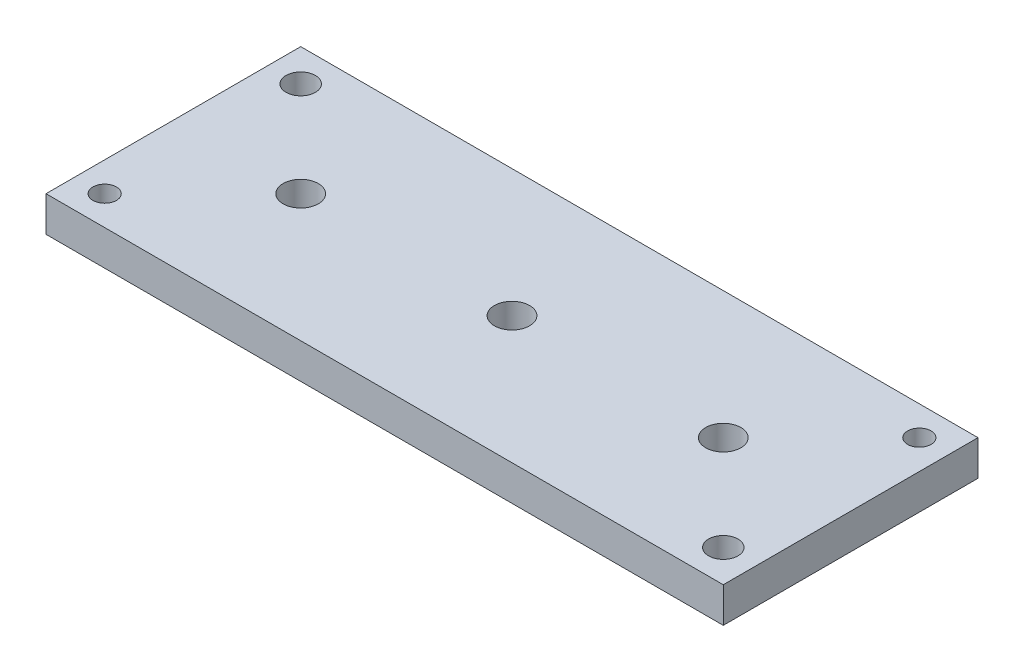
ISO-10303-21;
HEADER;
FILE_DESCRIPTION(('STEP AP214'),'2;1');
FILE_NAME('part.step','',(''),(''),'','','');
FILE_SCHEMA(('AUTOMOTIVE_DESIGN { 1 0 10303 214 1 1 1 1 }'));
ENDSEC;
DATA;
#1=APPLICATION_CONTEXT('core data for automotive mechanical design processes');
#2=APPLICATION_PROTOCOL_DEFINITION('international standard','automotive_design',2000,#1);
#3=PRODUCT_CONTEXT('',#1,'mechanical');
#4=PRODUCT('Part','Part','',(#3));
#5=PRODUCT_RELATED_PRODUCT_CATEGORY('part','',(#4));
#6=PRODUCT_DEFINITION_FORMATION('','',#4);
#7=PRODUCT_DEFINITION_CONTEXT('part definition',#1,'design');
#8=PRODUCT_DEFINITION('design','',#6,#7);
#9=PRODUCT_DEFINITION_SHAPE('','',#8);
#10=(LENGTH_UNIT() NAMED_UNIT(*) SI_UNIT(.MILLI.,.METRE.));
#11=(NAMED_UNIT(*) PLANE_ANGLE_UNIT() SI_UNIT($,.RADIAN.));
#12=(NAMED_UNIT(*) SI_UNIT($,.STERADIAN.) SOLID_ANGLE_UNIT());
#13=UNCERTAINTY_MEASURE_WITH_UNIT(LENGTH_MEASURE(1.E-05),#10,'distance_accuracy_value','');
#14=(GEOMETRIC_REPRESENTATION_CONTEXT(3) GLOBAL_UNCERTAINTY_ASSIGNED_CONTEXT((#13)) GLOBAL_UNIT_ASSIGNED_CONTEXT((#10,
#11,#12)) REPRESENTATION_CONTEXT('',''));
#15=CARTESIAN_POINT('',(0.,0.,0.));
#16=DIRECTION('',(0.,0.,1.));
#17=DIRECTION('',(1.,0.,0.));
#18=AXIS2_PLACEMENT_3D('',#15,#16,#17);
#19=CARTESIAN_POINT('',(2.5,69.,-2.5));
#20=DIRECTION('',(0.,1.,0.));
#21=DIRECTION('',(0.,0.,1.));
#22=AXIS2_PLACEMENT_3D('',#19,#20,#21);
#23=CYLINDRICAL_SURFACE('',#22,1.);
#24=CARTESIAN_POINT('',(2.5,77.,-2.5));
#25=DIRECTION('',(0.,1.,0.));
#26=DIRECTION('',(0.,0.,1.));
#27=AXIS2_PLACEMENT_3D('',#24,#25,#26);
#28=CIRCLE('',#27,1.);
#29=CARTESIAN_POINT('',(2.5,77.,-1.5));
#30=VERTEX_POINT('',#29);
#31=EDGE_CURVE('E140',#30,#30,#28,.F.);
#32=ORIENTED_EDGE('',*,*,#31,.T.);
#33=EDGE_LOOP('',(#32));
#34=FACE_BOUND('',#33,.T.);
#35=CARTESIAN_POINT('',(2.5,80.,-2.5));
#36=DIRECTION('',(0.,1.,0.));
#37=DIRECTION('',(0.,0.,1.));
#38=AXIS2_PLACEMENT_3D('',#35,#36,#37);
#39=CIRCLE('',#38,1.);
#40=CARTESIAN_POINT('',(2.5,80.,-1.5));
#41=VERTEX_POINT('',#40);
#42=EDGE_CURVE('E109',#41,#41,#39,.T.);
#43=ORIENTED_EDGE('',*,*,#42,.T.);
#44=EDGE_LOOP('',(#43));
#45=FACE_BOUND('',#44,.T.);
#46=ADVANCED_FACE('F33',(#34,#45),#23,.F.);
#47=CARTESIAN_POINT('',(0.,77.,0.));
#48=DIRECTION('',(0.,1.,0.));
#49=DIRECTION('',(0.,0.,1.));
#50=AXIS2_PLACEMENT_3D('',#47,#48,#49);
#51=PLANE('',#50);
#52=CARTESIAN_POINT('',(2.75,77.,-18.95));
#53=DIRECTION('',(0.,1.,0.));
#54=DIRECTION('',(0.,0.,1.));
#55=AXIS2_PLACEMENT_3D('',#52,#53,#54);
#56=CIRCLE('',#55,1.25);
#57=CARTESIAN_POINT('',(2.75,77.,-17.7));
#58=VERTEX_POINT('',#57);
#59=EDGE_CURVE('E118',#58,#58,#56,.T.);
#60=ORIENTED_EDGE('',*,*,#59,.T.);
#61=EDGE_LOOP('',(#60));
#62=FACE_BOUND('',#61,.T.);
#63=CARTESIAN_POINT('',(54.95,77.,-2.75));
#64=DIRECTION('',(0.,1.,0.));
#65=DIRECTION('',(0.,0.,1.));
#66=AXIS2_PLACEMENT_3D('',#63,#64,#65);
#67=CIRCLE('',#66,1.25);
#68=CARTESIAN_POINT('',(54.95,77.,-1.5));
#69=VERTEX_POINT('',#68);
#70=EDGE_CURVE('E124',#69,#69,#67,.T.);
#71=ORIENTED_EDGE('',*,*,#70,.T.);
#72=EDGE_LOOP('',(#71));
#73=FACE_BOUND('',#72,.T.);
#74=DIRECTION('',(1.,0.,0.));
#75=VECTOR('',#74,1.);
#76=CARTESIAN_POINT('',(0.,77.,0.));
#77=LINE('',#76,#75);
#78=CARTESIAN_POINT('',(0.,77.,0.));
#79=VERTEX_POINT('',#78);
#80=CARTESIAN_POINT('',(57.7,77.,0.));
#81=VERTEX_POINT('',#80);
#82=EDGE_CURVE('E48',#79,#81,#77,.T.);
#83=ORIENTED_EDGE('',*,*,#82,.F.);
#84=DIRECTION('',(0.,0.,1.));
#85=VECTOR('',#84,1.);
#86=CARTESIAN_POINT('',(0.,77.,0.));
#87=LINE('',#86,#85);
#88=CARTESIAN_POINT('',(0.,77.,-21.7));
#89=VERTEX_POINT('',#88);
#90=EDGE_CURVE('E73',#89,#79,#87,.T.);
#91=ORIENTED_EDGE('',*,*,#90,.F.);
#92=DIRECTION('',(1.,0.,0.));
#93=VECTOR('',#92,1.);
#94=CARTESIAN_POINT('',(70.5298787953836,77.,-21.7));
#95=LINE('',#94,#93);
#96=CARTESIAN_POINT('',(57.7,77.,-21.7));
#97=VERTEX_POINT('',#96);
#98=EDGE_CURVE('E76',#89,#97,#95,.T.);
#99=ORIENTED_EDGE('',*,*,#98,.T.);
#100=DIRECTION('',(0.,0.,-1.));
#101=VECTOR('',#100,1.);
#102=CARTESIAN_POINT('',(57.7,77.,0.));
#103=LINE('',#102,#101);
#104=EDGE_CURVE('E98',#81,#97,#103,.T.);
#105=ORIENTED_EDGE('',*,*,#104,.F.);
#106=EDGE_LOOP('',(#83,#91,#99,#105));
#107=FACE_BOUND('',#106,.T.);
#108=CARTESIAN_POINT('',(55.2,77.,-19.2));
#109=DIRECTION('',(0.,1.,0.));
#110=DIRECTION('',(0.,0.,1.));
#111=AXIS2_PLACEMENT_3D('',#108,#109,#110);
#112=CIRCLE('',#111,0.999999999999998);
#113=CARTESIAN_POINT('',(55.2,77.,-18.2));
#114=VERTEX_POINT('',#113);
#115=EDGE_CURVE('E79',#114,#114,#112,.F.);
#116=ORIENTED_EDGE('',*,*,#115,.F.);
#117=EDGE_LOOP('',(#116));
#118=FACE_BOUND('',#117,.T.);
#119=ORIENTED_EDGE('',*,*,#31,.F.);
#120=EDGE_LOOP('',(#119));
#121=FACE_BOUND('',#120,.T.);
#122=CARTESIAN_POINT('',(28.85,77.,-10.85));
#123=DIRECTION('',(0.,1.,0.));
#124=DIRECTION('',(0.,0.,1.));
#125=AXIS2_PLACEMENT_3D('',#122,#123,#124);
#126=CIRCLE('',#125,1.5);
#127=CARTESIAN_POINT('',(28.85,77.,-9.35));
#128=VERTEX_POINT('',#127);
#129=EDGE_CURVE('E133',#128,#128,#126,.T.);
#130=ORIENTED_EDGE('',*,*,#129,.T.);
#131=EDGE_LOOP('',(#130));
#132=FACE_BOUND('',#131,.T.);
#133=CARTESIAN_POINT('',(46.85,77.,-10.85));
#134=DIRECTION('',(0.,1.,0.));
#135=DIRECTION('',(0.,0.,1.));
#136=AXIS2_PLACEMENT_3D('',#133,#134,#135);
#137=CIRCLE('',#136,1.5);
#138=CARTESIAN_POINT('',(46.85,77.,-9.34999999999999));
#139=VERTEX_POINT('',#138);
#140=EDGE_CURVE('E139',#139,#139,#137,.T.);
#141=ORIENTED_EDGE('',*,*,#140,.T.);
#142=EDGE_LOOP('',(#141));
#143=FACE_BOUND('',#142,.T.);
#144=CARTESIAN_POINT('',(10.85,77.,-10.85));
#145=DIRECTION('',(0.,1.,0.));
#146=DIRECTION('',(0.,0.,1.));
#147=AXIS2_PLACEMENT_3D('',#144,#145,#146);
#148=CIRCLE('',#147,1.5);
#149=CARTESIAN_POINT('',(10.85,77.,-9.34999999999999));
#150=VERTEX_POINT('',#149);
#151=EDGE_CURVE('E127',#150,#150,#148,.T.);
#152=ORIENTED_EDGE('',*,*,#151,.T.);
#153=EDGE_LOOP('',(#152));
#154=FACE_BOUND('',#153,.T.);
#155=ADVANCED_FACE('F74',(#62,#73,#107,#118,#121,#132,#143,#154),#51,.F.);
#156=CARTESIAN_POINT('',(0.,80.,0.));
#157=DIRECTION('',(0.,1.,0.));
#158=DIRECTION('',(0.,0.,1.));
#159=AXIS2_PLACEMENT_3D('',#156,#157,#158);
#160=PLANE('',#159);
#161=CARTESIAN_POINT('',(28.85,80.,-10.85));
#162=DIRECTION('',(0.,1.,0.));
#163=DIRECTION('',(0.,0.,1.));
#164=AXIS2_PLACEMENT_3D('',#161,#162,#163);
#165=CIRCLE('',#164,1.5);
#166=CARTESIAN_POINT('',(28.85,80.,-9.35));
#167=VERTEX_POINT('',#166);
#168=EDGE_CURVE('E143',#167,#167,#165,.T.);
#169=ORIENTED_EDGE('',*,*,#168,.F.);
#170=EDGE_LOOP('',(#169));
#171=FACE_BOUND('',#170,.T.);
#172=CARTESIAN_POINT('',(46.85,80.,-10.85));
#173=DIRECTION('',(0.,1.,0.));
#174=DIRECTION('',(0.,0.,1.));
#175=AXIS2_PLACEMENT_3D('',#172,#173,#174);
#176=CIRCLE('',#175,1.5);
#177=CARTESIAN_POINT('',(46.85,80.,-9.34999999999999));
#178=VERTEX_POINT('',#177);
#179=EDGE_CURVE('E136',#178,#178,#176,.T.);
#180=ORIENTED_EDGE('',*,*,#179,.F.);
#181=EDGE_LOOP('',(#180));
#182=FACE_BOUND('',#181,.T.);
#183=CARTESIAN_POINT('',(10.85,80.,-10.85));
#184=DIRECTION('',(0.,1.,0.));
#185=DIRECTION('',(0.,0.,1.));
#186=AXIS2_PLACEMENT_3D('',#183,#184,#185);
#187=CIRCLE('',#186,1.5);
#188=CARTESIAN_POINT('',(10.85,80.,-9.34999999999999));
#189=VERTEX_POINT('',#188);
#190=EDGE_CURVE('E130',#189,#189,#187,.T.);
#191=ORIENTED_EDGE('',*,*,#190,.F.);
#192=EDGE_LOOP('',(#191));
#193=FACE_BOUND('',#192,.T.);
#194=CARTESIAN_POINT('',(2.75,80.,-18.95));
#195=DIRECTION('',(0.,1.,0.));
#196=DIRECTION('',(0.,0.,1.));
#197=AXIS2_PLACEMENT_3D('',#194,#195,#196);
#198=CIRCLE('',#197,1.25);
#199=CARTESIAN_POINT('',(2.75,80.,-17.7));
#200=VERTEX_POINT('',#199);
#201=EDGE_CURVE('E117',#200,#200,#198,.T.);
#202=ORIENTED_EDGE('',*,*,#201,.F.);
#203=EDGE_LOOP('',(#202));
#204=FACE_BOUND('',#203,.T.);
#205=ORIENTED_EDGE('',*,*,#42,.F.);
#206=EDGE_LOOP('',(#205));
#207=FACE_BOUND('',#206,.T.);
#208=DIRECTION('',(0.,0.,1.));
#209=VECTOR('',#208,1.);
#210=CARTESIAN_POINT('',(0.,80.,-21.7));
#211=LINE('',#210,#209);
#212=CARTESIAN_POINT('',(0.,80.,-21.7));
#213=VERTEX_POINT('',#212);
#214=CARTESIAN_POINT('',(0.,80.,0.));
#215=VERTEX_POINT('',#214);
#216=EDGE_CURVE('E87',#213,#215,#211,.T.);
#217=ORIENTED_EDGE('',*,*,#216,.T.);
#218=DIRECTION('',(1.,0.,0.));
#219=VECTOR('',#218,1.);
#220=CARTESIAN_POINT('',(0.,80.,0.));
#221=LINE('',#220,#219);
#222=CARTESIAN_POINT('',(57.7,80.,0.));
#223=VERTEX_POINT('',#222);
#224=EDGE_CURVE('E104',#215,#223,#221,.T.);
#225=ORIENTED_EDGE('',*,*,#224,.T.);
#226=DIRECTION('',(0.,0.,-1.));
#227=VECTOR('',#226,1.);
#228=CARTESIAN_POINT('',(57.7,80.,-21.7));
#229=LINE('',#228,#227);
#230=CARTESIAN_POINT('',(57.7,80.,-21.7));
#231=VERTEX_POINT('',#230);
#232=EDGE_CURVE('E91',#223,#231,#229,.T.);
#233=ORIENTED_EDGE('',*,*,#232,.T.);
#234=DIRECTION('',(-1.,0.,0.));
#235=VECTOR('',#234,1.);
#236=CARTESIAN_POINT('',(0.,80.,-21.7));
#237=LINE('',#236,#235);
#238=EDGE_CURVE('E88',#231,#213,#237,.T.);
#239=ORIENTED_EDGE('',*,*,#238,.T.);
#240=EDGE_LOOP('',(#217,#225,#233,#239));
#241=FACE_BOUND('',#240,.T.);
#242=CARTESIAN_POINT('',(55.2,80.,-19.2));
#243=DIRECTION('',(0.,1.,0.));
#244=DIRECTION('',(0.,0.,1.));
#245=AXIS2_PLACEMENT_3D('',#242,#243,#244);
#246=CIRCLE('',#245,0.999999999999998);
#247=CARTESIAN_POINT('',(55.2,80.,-18.2));
#248=VERTEX_POINT('',#247);
#249=EDGE_CURVE('E114',#248,#248,#246,.T.);
#250=ORIENTED_EDGE('',*,*,#249,.F.);
#251=EDGE_LOOP('',(#250));
#252=FACE_BOUND('',#251,.T.);
#253=CARTESIAN_POINT('',(54.95,80.,-2.75));
#254=DIRECTION('',(0.,1.,0.));
#255=DIRECTION('',(0.,0.,1.));
#256=AXIS2_PLACEMENT_3D('',#253,#254,#255);
#257=CIRCLE('',#256,1.25);
#258=CARTESIAN_POINT('',(54.95,80.,-1.5));
#259=VERTEX_POINT('',#258);
#260=EDGE_CURVE('E121',#259,#259,#257,.T.);
#261=ORIENTED_EDGE('',*,*,#260,.F.);
#262=EDGE_LOOP('',(#261));
#263=FACE_BOUND('',#262,.T.);
#264=ADVANCED_FACE('F106',(#171,#182,#193,#204,#207,#241,#252,#263),#160,.T.);
#265=CARTESIAN_POINT('',(2.75,80.,-18.95));
#266=DIRECTION('',(0.,-1.,0.));
#267=DIRECTION('',(0.,0.,-1.));
#268=AXIS2_PLACEMENT_3D('',#265,#266,#267);
#269=CYLINDRICAL_SURFACE('',#268,1.25);
#270=ORIENTED_EDGE('',*,*,#201,.T.);
#271=EDGE_LOOP('',(#270));
#272=FACE_BOUND('',#271,.T.);
#273=ORIENTED_EDGE('',*,*,#59,.F.);
#274=EDGE_LOOP('',(#273));
#275=FACE_BOUND('',#274,.T.);
#276=ADVANCED_FACE('F178',(#272,#275),#269,.F.);
#277=CARTESIAN_POINT('',(54.95,80.,-2.75));
#278=DIRECTION('',(0.,-1.,0.));
#279=DIRECTION('',(0.,0.,-1.));
#280=AXIS2_PLACEMENT_3D('',#277,#278,#279);
#281=CYLINDRICAL_SURFACE('',#280,1.25);
#282=ORIENTED_EDGE('',*,*,#260,.T.);
#283=EDGE_LOOP('',(#282));
#284=FACE_BOUND('',#283,.T.);
#285=ORIENTED_EDGE('',*,*,#70,.F.);
#286=EDGE_LOOP('',(#285));
#287=FACE_BOUND('',#286,.T.);
#288=ADVANCED_FACE('F195',(#284,#287),#281,.F.);
#289=CARTESIAN_POINT('',(0.,2.,-21.7));
#290=DIRECTION('',(0.,0.,1.));
#291=DIRECTION('',(1.,0.,0.));
#292=AXIS2_PLACEMENT_3D('',#289,#290,#291);
#293=PLANE('',#292);
#294=DIRECTION('',(0.,-1.,0.));
#295=VECTOR('',#294,1.);
#296=CARTESIAN_POINT('',(57.7,2.,-21.7));
#297=LINE('',#296,#295);
#298=EDGE_CURVE('E83',#231,#97,#297,.T.);
#299=ORIENTED_EDGE('',*,*,#298,.T.);
#300=ORIENTED_EDGE('',*,*,#98,.F.);
#301=DIRECTION('',(0.,-1.,0.));
#302=VECTOR('',#301,1.);
#303=CARTESIAN_POINT('',(0.,2.,-21.7));
#304=LINE('',#303,#302);
#305=EDGE_CURVE('E56',#213,#89,#304,.T.);
#306=ORIENTED_EDGE('',*,*,#305,.F.);
#307=ORIENTED_EDGE('',*,*,#238,.F.);
#308=EDGE_LOOP('',(#299,#300,#306,#307));
#309=FACE_BOUND('',#308,.T.);
#310=ADVANCED_FACE('F82',(#309),#293,.F.);
#311=CARTESIAN_POINT('',(57.7,2.,0.));
#312=DIRECTION('',(-1.,0.,0.));
#313=DIRECTION('',(0.,0.,1.));
#314=AXIS2_PLACEMENT_3D('',#311,#312,#313);
#315=PLANE('',#314);
#316=DIRECTION('',(0.,-1.,0.));
#317=VECTOR('',#316,1.);
#318=CARTESIAN_POINT('',(57.7,2.,0.));
#319=LINE('',#318,#317);
#320=EDGE_CURVE('E41',#223,#81,#319,.T.);
#321=ORIENTED_EDGE('',*,*,#320,.T.);
#322=ORIENTED_EDGE('',*,*,#104,.T.);
#323=ORIENTED_EDGE('',*,*,#298,.F.);
#324=ORIENTED_EDGE('',*,*,#232,.F.);
#325=EDGE_LOOP('',(#321,#322,#323,#324));
#326=FACE_BOUND('',#325,.T.);
#327=ADVANCED_FACE('F97',(#326),#315,.F.);
#328=CARTESIAN_POINT('',(0.,2.,0.));
#329=DIRECTION('',(0.,0.,-1.));
#330=DIRECTION('',(-1.,0.,0.));
#331=AXIS2_PLACEMENT_3D('',#328,#329,#330);
#332=PLANE('',#331);
#333=DIRECTION('',(0.,-1.,0.));
#334=VECTOR('',#333,1.);
#335=CARTESIAN_POINT('',(0.,2.,0.));
#336=LINE('',#335,#334);
#337=EDGE_CURVE('E11',#215,#79,#336,.T.);
#338=ORIENTED_EDGE('',*,*,#337,.T.);
#339=ORIENTED_EDGE('',*,*,#82,.T.);
#340=ORIENTED_EDGE('',*,*,#320,.F.);
#341=ORIENTED_EDGE('',*,*,#224,.F.);
#342=EDGE_LOOP('',(#338,#339,#340,#341));
#343=FACE_BOUND('',#342,.T.);
#344=ADVANCED_FACE('F103',(#343),#332,.F.);
#345=CARTESIAN_POINT('',(0.,2.,0.));
#346=DIRECTION('',(1.,0.,0.));
#347=DIRECTION('',(0.,0.,-1.));
#348=AXIS2_PLACEMENT_3D('',#345,#346,#347);
#349=PLANE('',#348);
#350=ORIENTED_EDGE('',*,*,#305,.T.);
#351=ORIENTED_EDGE('',*,*,#90,.T.);
#352=ORIENTED_EDGE('',*,*,#337,.F.);
#353=ORIENTED_EDGE('',*,*,#216,.F.);
#354=EDGE_LOOP('',(#350,#351,#352,#353));
#355=FACE_BOUND('',#354,.T.);
#356=ADVANCED_FACE('F35',(#355),#349,.F.);
#357=CARTESIAN_POINT('',(55.2,69.,-19.2));
#358=DIRECTION('',(0.,1.,0.));
#359=DIRECTION('',(0.,0.,1.));
#360=AXIS2_PLACEMENT_3D('',#357,#358,#359);
#361=CYLINDRICAL_SURFACE('',#360,0.999999999999998);
#362=ORIENTED_EDGE('',*,*,#115,.T.);
#363=EDGE_LOOP('',(#362));
#364=FACE_BOUND('',#363,.T.);
#365=ORIENTED_EDGE('',*,*,#249,.T.);
#366=EDGE_LOOP('',(#365));
#367=FACE_BOUND('',#366,.T.);
#368=ADVANCED_FACE('F155',(#364,#367),#361,.F.);
#369=CARTESIAN_POINT('',(10.85,77.,-10.85));
#370=DIRECTION('',(0.,1.,0.));
#371=DIRECTION('',(0.,0.,1.));
#372=AXIS2_PLACEMENT_3D('',#369,#370,#371);
#373=CYLINDRICAL_SURFACE('',#372,1.5);
#374=ORIENTED_EDGE('',*,*,#151,.F.);
#375=EDGE_LOOP('',(#374));
#376=FACE_BOUND('',#375,.T.);
#377=ORIENTED_EDGE('',*,*,#190,.T.);
#378=EDGE_LOOP('',(#377));
#379=FACE_BOUND('',#378,.T.);
#380=ADVANCED_FACE('F169',(#376,#379),#373,.F.);
#381=CARTESIAN_POINT('',(46.85,77.,-10.85));
#382=DIRECTION('',(0.,1.,0.));
#383=DIRECTION('',(0.,0.,1.));
#384=AXIS2_PLACEMENT_3D('',#381,#382,#383);
#385=CYLINDRICAL_SURFACE('',#384,1.5);
#386=ORIENTED_EDGE('',*,*,#140,.F.);
#387=EDGE_LOOP('',(#386));
#388=FACE_BOUND('',#387,.T.);
#389=ORIENTED_EDGE('',*,*,#179,.T.);
#390=EDGE_LOOP('',(#389));
#391=FACE_BOUND('',#390,.T.);
#392=ADVANCED_FACE('F172',(#388,#391),#385,.F.);
#393=CARTESIAN_POINT('',(28.85,77.,-10.85));
#394=DIRECTION('',(0.,1.,0.));
#395=DIRECTION('',(0.,0.,1.));
#396=AXIS2_PLACEMENT_3D('',#393,#394,#395);
#397=CYLINDRICAL_SURFACE('',#396,1.5);
#398=ORIENTED_EDGE('',*,*,#129,.F.);
#399=EDGE_LOOP('',(#398));
#400=FACE_BOUND('',#399,.T.);
#401=ORIENTED_EDGE('',*,*,#168,.T.);
#402=EDGE_LOOP('',(#401));
#403=FACE_BOUND('',#402,.T.);
#404=ADVANCED_FACE('F218',(#400,#403),#397,.F.);
#405=CLOSED_SHELL('',(#46,#155,#264,#276,#288,#310,#327,#344,#356,#368,#380,#392,#404));
#406=MANIFOLD_SOLID_BREP('B2',#405);
#407=ADVANCED_BREP_SHAPE_REPRESENTATION('',(#18,#406),#14);
#408=SHAPE_DEFINITION_REPRESENTATION(#9,#407);
ENDSEC;
END-ISO-10303-21;
